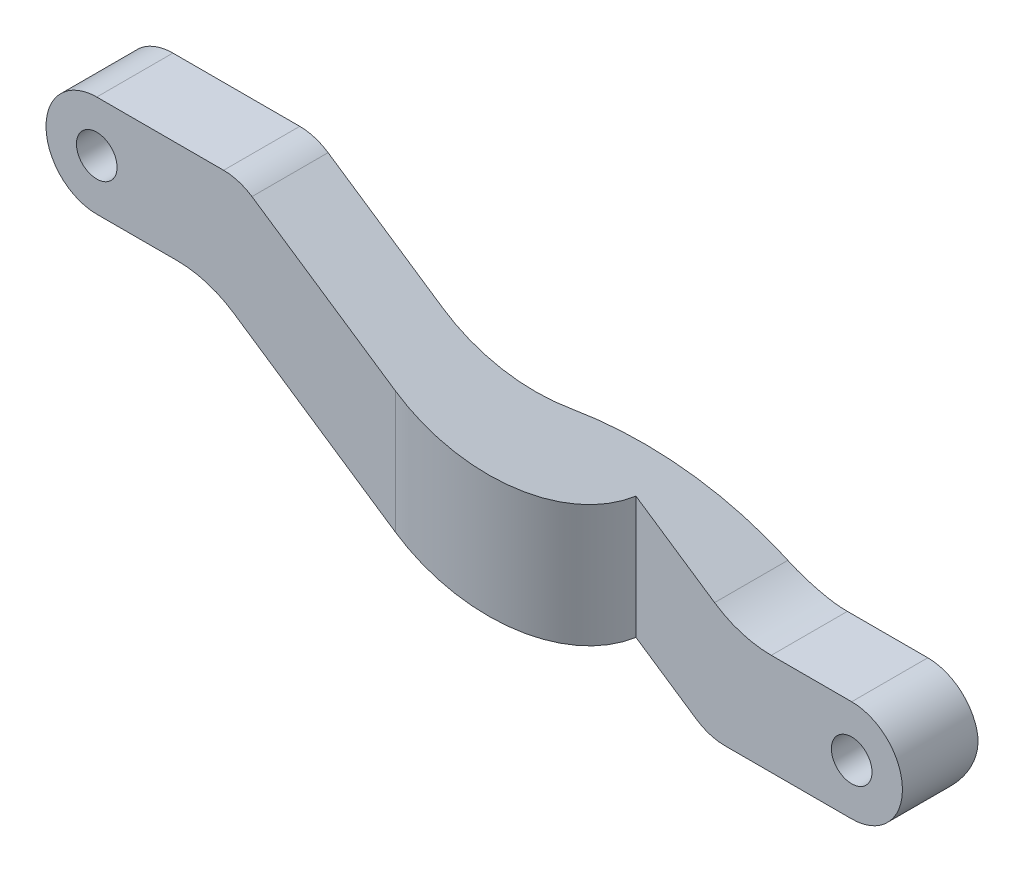
ISO-10303-21;
HEADER;
FILE_DESCRIPTION(('STEP AP214'),'2;1');
FILE_NAME('part.step','',(''),(''),'','','');
FILE_SCHEMA(('AUTOMOTIVE_DESIGN { 1 0 10303 214 1 1 1 1 }'));
ENDSEC;
DATA;
#1=APPLICATION_CONTEXT('core data for automotive mechanical design processes');
#2=APPLICATION_PROTOCOL_DEFINITION('international standard','automotive_design',2000,#1);
#3=PRODUCT_CONTEXT('',#1,'mechanical');
#4=PRODUCT('Part','Part','',(#3));
#5=PRODUCT_RELATED_PRODUCT_CATEGORY('part','',(#4));
#6=PRODUCT_DEFINITION_FORMATION('','',#4);
#7=PRODUCT_DEFINITION_CONTEXT('part definition',#1,'design');
#8=PRODUCT_DEFINITION('design','',#6,#7);
#9=PRODUCT_DEFINITION_SHAPE('','',#8);
#10=(LENGTH_UNIT() NAMED_UNIT(*) SI_UNIT(.MILLI.,.METRE.));
#11=(NAMED_UNIT(*) PLANE_ANGLE_UNIT() SI_UNIT($,.RADIAN.));
#12=(NAMED_UNIT(*) SI_UNIT($,.STERADIAN.) SOLID_ANGLE_UNIT());
#13=UNCERTAINTY_MEASURE_WITH_UNIT(LENGTH_MEASURE(1.E-05),#10,'distance_accuracy_value','');
#14=(GEOMETRIC_REPRESENTATION_CONTEXT(3) GLOBAL_UNCERTAINTY_ASSIGNED_CONTEXT((#13)) GLOBAL_UNIT_ASSIGNED_CONTEXT((#10,
#11,#12)) REPRESENTATION_CONTEXT('',''));
#15=CARTESIAN_POINT('',(0.,0.,0.));
#16=DIRECTION('',(0.,0.,1.));
#17=DIRECTION('',(1.,0.,0.));
#18=AXIS2_PLACEMENT_3D('',#15,#16,#17);
#19=CARTESIAN_POINT('',(0.,-5.5,-4.5));
#20=DIRECTION('',(0.,0.,-1.));
#21=DIRECTION('',(-1.,0.,0.));
#22=AXIS2_PLACEMENT_3D('',#19,#20,#21);
#23=CYLINDRICAL_SURFACE('',#22,0.799999999999998);
#24=CARTESIAN_POINT('',(0.,-5.5,-9.));
#25=DIRECTION('',(0.,0.,1.));
#26=DIRECTION('',(1.,0.,0.));
#27=AXIS2_PLACEMENT_3D('',#24,#25,#26);
#28=CIRCLE('',#27,0.799999999999998);
#29=CARTESIAN_POINT('',(0.799999999999998,-5.5,-9.));
#30=VERTEX_POINT('',#29);
#31=EDGE_CURVE('E434',#30,#30,#28,.T.);
#32=ORIENTED_EDGE('',*,*,#31,.T.);
#33=EDGE_LOOP('',(#32));
#34=FACE_BOUND('',#33,.T.);
#35=CARTESIAN_POINT('',(0.,-5.5,-10.5));
#36=DIRECTION('',(0.,0.,-1.));
#37=DIRECTION('',(-1.,0.,0.));
#38=AXIS2_PLACEMENT_3D('',#35,#36,#37);
#39=CIRCLE('',#38,0.799999999999998);
#40=CARTESIAN_POINT('',(-0.799999999999997,-5.5,-10.5));
#41=VERTEX_POINT('',#40);
#42=EDGE_CURVE('E47',#41,#41,#39,.T.);
#43=ORIENTED_EDGE('',*,*,#42,.T.);
#44=EDGE_LOOP('',(#43));
#45=FACE_BOUND('',#44,.T.);
#46=ADVANCED_FACE('F43',(#34,#45),#23,.F.);
#47=CARTESIAN_POINT('',(-5.22291133313636,-7.76072430045907,-4.5));
#48=DIRECTION('',(-0.558328318996176,-0.829620086670341,0.));
#49=DIRECTION('',(0.829620086670341,-0.558328318996176,0.));
#50=AXIS2_PLACEMENT_3D('',#47,#48,#49);
#51=PLANE('',#50);
#52=CARTESIAN_POINT('',(-3.89835345575501,-8.65214217349972,-2.));
#53=DIRECTION('',(-0.558328318996176,-0.829620086670341,0.));
#54=DIRECTION('',(0.829620086670341,-0.558328318996176,0.));
#55=AXIS2_PLACEMENT_3D('',#52,#53,#54);
#56=ELLIPSE('',#55,12.0537100784707,10.);
#57=CARTESIAN_POINT('',(-11.0397818842979,-3.84601248377317,-9.));
#58=VERTEX_POINT('',#57);
#59=CARTESIAN_POINT('',(-6.75535476145084,-6.72940095494858,-11.5831906763485));
#60=VERTEX_POINT('',#59);
#61=EDGE_CURVE('E461',#58,#60,#56,.T.);
#62=ORIENTED_EDGE('',*,*,#61,.T.);
#63=CARTESIAN_POINT('',(-7.44776461675071,-6.26341412943989,-11.7943579510743));
#64=CARTESIAN_POINT('',(-7.39082496292304,-6.30173410471108,-11.7808860215062));
#65=CARTESIAN_POINT('',(-7.33400862964027,-6.33997108614744,-11.7666329862026));
#66=CARTESIAN_POINT('',(-7.22067273472351,-6.41624532384669,-11.736400693206));
#67=CARTESIAN_POINT('',(-7.16415328375281,-6.45428250563398,-11.7204208339319));
#68=CARTESIAN_POINT('',(-7.05135145071648,-6.53019732354978,-11.6865350971831));
#69=CARTESIAN_POINT('',(-6.99507009825785,-6.56807426676023,-11.6686242126672));
#70=CARTESIAN_POINT('',(-6.88300399879011,-6.64349394130475,-11.6307014867902));
#71=CARTESIAN_POINT('',(-6.82721917633171,-6.68103672341567,-11.6106899707501));
#72=CARTESIAN_POINT('',(-6.71540744172286,-6.75628521224958,-11.5679643601963));
#73=CARTESIAN_POINT('',(-6.65939023573404,-6.793984386796,-11.545213104872));
#74=CARTESIAN_POINT('',(-6.54825145805766,-6.8687799804808,-11.4969172994951));
#75=CARTESIAN_POINT('',(-6.49312902529173,-6.90587697911869,-11.4713756434074));
#76=CARTESIAN_POINT('',(-6.38347733178552,-6.9796717759107,-11.4167197123286));
#77=CARTESIAN_POINT('',(-6.32895890664111,-7.01636228178716,-11.3875733803327));
#78=CARTESIAN_POINT('',(-6.24835741066871,-7.07060650571314,-11.3407692581652));
#79=CARTESIAN_POINT('',(-6.22166317898296,-7.0885715306004,-11.3246381424522));
#80=CARTESIAN_POINT('',(-6.16876633712455,-7.12417072265172,-11.2912235391192));
#81=CARTESIAN_POINT('',(-6.14256387976717,-7.14180478697221,-11.2739397006547));
#82=CARTESIAN_POINT('',(-6.11665663799235,-7.15924017334047,-11.2560194935183));
#83=B_SPLINE_CURVE_WITH_KNOTS('',3,(#63,#64,#65,#66,#67,#68,#69,#70,#71,#72,#73,#74,#75,#76,#77,
#78,#79,#80,#81,#82),.UNSPECIFIED.,.F.,.F.,(4,2,2,2,2,2,2,2,2,4),(0.,0.209831551112915,
0.419736439270804,0.630199320987733,0.840629656668131,1.05432960988827,1.26780999882545,
1.48334768269615,1.59130768329374,1.69930069404956),.UNSPECIFIED.);
#84=CARTESIAN_POINT('',(-6.11665663799226,-7.15924017334044,-11.2560194935185));
#85=VERTEX_POINT('',#84);
#86=EDGE_CURVE('E65',#60,#85,#83,.T.);
#87=ORIENTED_EDGE('',*,*,#86,.T.);
#88=DIRECTION('',(0.,0.,-1.));
#89=VECTOR('',#88,1.);
#90=CARTESIAN_POINT('',(-6.11665663799226,-7.15924017334053,-4.5));
#91=LINE('',#90,#89);
#92=CARTESIAN_POINT('',(-6.11665663799226,-7.15924017334053,-9.));
#93=VERTEX_POINT('',#92);
#94=EDGE_CURVE('E301',#93,#85,#91,.T.);
#95=ORIENTED_EDGE('',*,*,#94,.F.);
#96=DIRECTION('',(-0.829620086670341,0.558328318996176,0.));
#97=VECTOR('',#96,1.);
#98=CARTESIAN_POINT('',(-5.22291133313636,-7.76072430045907,-9.));
#99=LINE('',#98,#97);
#100=CARTESIAN_POINT('',(-8.5,-5.55526732567099,-9.));
#101=VERTEX_POINT('',#100);
#102=EDGE_CURVE('E440',#93,#101,#99,.T.);
#103=ORIENTED_EDGE('',*,*,#102,.T.);
#104=CARTESIAN_POINT('',(-13.4749371855331,-2.20717057567752,-9.5));
#105=DIRECTION('',(-0.558328318996176,-0.829620086670341,0.));
#106=DIRECTION('',(0.829620086670341,-0.558328318996176,0.));
#107=AXIS2_PLACEMENT_3D('',#104,#105,#106);
#108=ELLIPSE('',#107,6.02685503923534,5.);
#109=CARTESIAN_POINT('',(-13.4749371855331,-2.20717057567752,-4.5));
#110=VERTEX_POINT('',#109);
#111=EDGE_CURVE('E391',#101,#110,#108,.T.);
#112=ORIENTED_EDGE('',*,*,#111,.T.);
#113=DIRECTION('',(-0.829620086670341,0.558328318996176,0.));
#114=VECTOR('',#113,1.);
#115=CARTESIAN_POINT('',(-5.22291133313636,-7.76072430045907,-4.5));
#116=LINE('',#115,#114);
#117=CARTESIAN_POINT('',(-19.8476514900797,2.08162006749579,-4.5));
#118=VERTEX_POINT('',#117);
#119=EDGE_CURVE('E388',#110,#118,#116,.T.);
#120=ORIENTED_EDGE('',*,*,#119,.T.);
#121=DIRECTION('',(0.,0.,-1.));
#122=VECTOR('',#121,1.);
#123=CARTESIAN_POINT('',(-19.8476514900797,2.08162006749579,-12.));
#124=LINE('',#123,#122);
#125=CARTESIAN_POINT('',(-19.8476514900797,2.08162006749579,-7.5));
#126=VERTEX_POINT('',#125);
#127=EDGE_CURVE('E340',#118,#126,#124,.T.);
#128=ORIENTED_EDGE('',*,*,#127,.T.);
#129=DIRECTION('',(0.829620086670341,-0.558328318996176,0.));
#130=VECTOR('',#129,1.);
#131=CARTESIAN_POINT('',(-5.22291133313636,-7.76072430045907,-7.5));
#132=LINE('',#131,#130);
#133=CARTESIAN_POINT('',(-14.6104960985693,-1.4429476389099,-7.5));
#134=VERTEX_POINT('',#133);
#135=EDGE_CURVE('E385',#126,#134,#132,.T.);
#136=ORIENTED_EDGE('',*,*,#135,.T.);
#137=CARTESIAN_POINT('',(-14.6104960985693,-1.4429476389099,-12.5));
#138=DIRECTION('',(-0.558328318996176,-0.829620086670341,0.));
#139=DIRECTION('',(0.829620086670341,-0.558328318996176,0.));
#140=AXIS2_PLACEMENT_3D('',#137,#138,#139);
#141=ELLIPSE('',#140,6.02685503923534,5.);
#142=EDGE_CURVE('E471',#134,#58,#141,.F.);
#143=ORIENTED_EDGE('',*,*,#142,.T.);
#144=EDGE_LOOP('',(#62,#87,#95,#103,#112,#120,#128,#136,#143));
#145=FACE_BOUND('',#144,.T.);
#146=ADVANCED_FACE('F206',(#145),#51,.T.);
#147=CARTESIAN_POINT('',(-5.,-5.5,-4.5));
#148=DIRECTION('',(0.,0.,-1.));
#149=DIRECTION('',(-1.,0.,0.));
#150=AXIS2_PLACEMENT_3D('',#147,#148,#149);
#151=CYLINDRICAL_SURFACE('',#150,1.99999999999982);
#152=CARTESIAN_POINT('',(-6.11665663799226,-7.15924017334044,-11.2560194935185));
#153=CARTESIAN_POINT('',(-6.01070827811085,-7.23050023380487,-11.1827244448648));
#154=CARTESIAN_POINT('',(-5.8995708494193,-7.29060982241429,-11.1066673038132));
#155=CARTESIAN_POINT('',(-5.66252875240181,-7.39176975725393,-10.9455439157998));
#156=CARTESIAN_POINT('',(-5.5361336285723,-7.43126431759017,-10.8602158791605));
#157=CARTESIAN_POINT('',(-5.27563910793045,-7.48549941127549,-10.6849100836675));
#158=CARTESIAN_POINT('',(-5.14142257519711,-7.49948810941587,-10.5948692521531));
#159=CARTESIAN_POINT('',(-5.00495179452469,-7.49999541093032,-10.5033217646004));
#160=CARTESIAN_POINT('',(-5.00247585205687,-7.50000000859125,-10.5016608518913));
#161=CARTESIAN_POINT('',(-5.,-7.49999999999991,-10.5));
#162=B_SPLINE_CURVE_WITH_KNOTS('',3,(#152,#153,#154,#155,#156,#157,#158,#159,#160,#161),
.UNSPECIFIED.,.F.,.F.,(4,2,2,2,4),(0.,0.440710293324501,0.91109410684645,1.39513215593204,
1.40407643847738),.UNSPECIFIED.);
#163=CARTESIAN_POINT('',(-4.99999999999998,-7.5,-10.5));
#164=VERTEX_POINT('',#163);
#165=EDGE_CURVE('E186',#164,#85,#162,.F.);
#166=ORIENTED_EDGE('',*,*,#165,.F.);
#167=DIRECTION('',(0.,0.,-1.));
#168=VECTOR('',#167,1.);
#169=CARTESIAN_POINT('',(-4.99999999999998,-7.49999999999982,-4.5));
#170=LINE('',#169,#168);
#171=CARTESIAN_POINT('',(-4.99999999999998,-7.5,-9.));
#172=VERTEX_POINT('',#171);
#173=EDGE_CURVE('E299',#172,#164,#170,.T.);
#174=ORIENTED_EDGE('',*,*,#173,.F.);
#175=CARTESIAN_POINT('',(-5.,-5.5,-9.));
#176=DIRECTION('',(0.,0.,1.));
#177=DIRECTION('',(1.,0.,0.));
#178=AXIS2_PLACEMENT_3D('',#175,#176,#177);
#179=CIRCLE('',#178,1.99999999999982);
#180=EDGE_CURVE('E438',#93,#172,#179,.T.);
#181=ORIENTED_EDGE('',*,*,#180,.F.);
#182=ORIENTED_EDGE('',*,*,#94,.T.);
#183=EDGE_LOOP('',(#166,#174,#181,#182));
#184=FACE_BOUND('',#183,.T.);
#185=ADVANCED_FACE('F281',(#184),#151,.T.);
#186=CARTESIAN_POINT('',(-2.6411164921747E-13,-7.5,-4.5));
#187=DIRECTION('',(0.,-1.,0.));
#188=DIRECTION('',(1.,0.,0.));
#189=AXIS2_PLACEMENT_3D('',#186,#187,#188);
#190=PLANE('',#189);
#191=ORIENTED_EDGE('',*,*,#173,.T.);
#192=DIRECTION('',(1.,0.,0.));
#193=VECTOR('',#192,1.);
#194=CARTESIAN_POINT('',(-27.25,-7.5,-10.5));
#195=LINE('',#194,#193);
#196=CARTESIAN_POINT('',(0.,-7.5,-10.5));
#197=VERTEX_POINT('',#196);
#198=EDGE_CURVE('E188',#164,#197,#195,.T.);
#199=ORIENTED_EDGE('',*,*,#198,.T.);
#200=DIRECTION('',(0.,0.,-1.));
#201=VECTOR('',#200,1.);
#202=CARTESIAN_POINT('',(0.,-7.5,-4.5));
#203=LINE('',#202,#201);
#204=CARTESIAN_POINT('',(0.,-7.5,-9.));
#205=VERTEX_POINT('',#204);
#206=EDGE_CURVE('E306',#205,#197,#203,.T.);
#207=ORIENTED_EDGE('',*,*,#206,.F.);
#208=DIRECTION('',(1.,0.,0.));
#209=VECTOR('',#208,1.);
#210=CARTESIAN_POINT('',(-8.5,-7.5,-9.));
#211=LINE('',#210,#209);
#212=EDGE_CURVE('E305',#172,#205,#211,.T.);
#213=ORIENTED_EDGE('',*,*,#212,.F.);
#214=EDGE_LOOP('',(#191,#199,#207,#213));
#215=FACE_BOUND('',#214,.T.);
#216=ADVANCED_FACE('F244',(#215),#190,.T.);
#217=CARTESIAN_POINT('',(0.,-5.5,-4.5));
#218=DIRECTION('',(0.,0.,-1.));
#219=DIRECTION('',(-1.,0.,0.));
#220=AXIS2_PLACEMENT_3D('',#217,#218,#219);
#221=CYLINDRICAL_SURFACE('',#220,2.);
#222=CARTESIAN_POINT('',(1.9364916731037,-5.,-12.));
#223=CARTESIAN_POINT('',(1.94923392572045,-5.04932114358372,-12.0000051867644));
#224=CARTESIAN_POINT('',(1.96007760968778,-5.09913225941096,-11.9991243200771));
#225=CARTESIAN_POINT('',(1.97792914676068,-5.19936735755571,-11.9955247867632));
#226=CARTESIAN_POINT('',(1.98493730657872,-5.24979129053882,-11.9928062671257));
#227=CARTESIAN_POINT('',(1.99506727771935,-5.35075466707215,-11.9854757968448));
#228=CARTESIAN_POINT('',(1.99819966781951,-5.40129341731143,-11.9808690460807));
#229=CARTESIAN_POINT('',(2.00063688520671,-5.50223782087149,-11.9697422920158));
#230=CARTESIAN_POINT('',(1.99994180028854,-5.55264347721865,-11.9632223326037));
#231=CARTESIAN_POINT('',(1.99217992905659,-5.70321693633348,-11.9407687393341));
#232=CARTESIAN_POINT('',(1.97943572214433,-5.80273298729622,-11.9219419759768));
#233=CARTESIAN_POINT('',(1.93978151030911,-5.99710218667242,-11.8769530945645));
#234=CARTESIAN_POINT('',(1.91286860891535,-6.09195437732795,-11.850789477166));
#235=CARTESIAN_POINT('',(1.84518258819586,-6.27810497671866,-11.7907667679181));
#236=CARTESIAN_POINT('',(1.80395413835133,-6.36916008465087,-11.7566688232968));
#237=CARTESIAN_POINT('',(1.70979795459834,-6.54226510376168,-11.6822853018577));
#238=CARTESIAN_POINT('',(1.65686153587891,-6.62430826202862,-11.6419951385416));
#239=CARTESIAN_POINT('',(1.53510240830725,-6.78639115870666,-11.5516802716319));
#240=CARTESIAN_POINT('',(1.4651873724096,-6.86528335533427,-11.5010756077231));
#241=CARTESIAN_POINT('',(1.31602755206121,-7.00958073663753,-11.3949080896696));
#242=CARTESIAN_POINT('',(1.23678935290203,-7.07499535223775,-11.3393487418346));
#243=CARTESIAN_POINT('',(1.10724930204743,-7.16651894037302,-11.2494533692392));
#244=CARTESIAN_POINT('',(1.05933263150913,-7.19735717739104,-11.2163839416346));
#245=CARTESIAN_POINT('',(0.961590718329308,-7.25457978817494,-11.1492267688548));
#246=CARTESIAN_POINT('',(0.911765388196588,-7.28096395747003,-11.1151389770144));
#247=CARTESIAN_POINT('',(0.758957395729926,-7.35385972531109,-11.0109508294172));
#248=CARTESIAN_POINT('',(0.653519174774761,-7.39350220876982,-10.9395318751726));
#249=CARTESIAN_POINT('',(0.438862700059606,-7.45444553533482,-10.7946785608128));
#250=CARTESIAN_POINT('',(0.329644176636772,-7.47574506715459,-10.7212440569987));
#251=CARTESIAN_POINT('',(0.149143166037845,-7.49569445807546,-10.600049813911));
#252=CARTESIAN_POINT('',(0.0782774000548524,-7.49972305566518,-10.5525101281418));
#253=CARTESIAN_POINT('',(0.00495185100895912,-7.49999540312661,-10.5033218026081));
#254=CARTESIAN_POINT('',(0.00247590904470673,-7.50000000075853,-10.501660890246));
#255=CARTESIAN_POINT('',(0.,-7.5,-10.5));
#256=B_SPLINE_CURVE_WITH_KNOTS('',3,(#222,#223,#224,#225,#226,#227,#228,#229,#230,#231,#232,
#233,#234,#235,#236,#237,#238,#239,#240,#241,#242,#243,#244,#245,#246,#247,#248,#249,#250,#251,
#252,#253,#254,#255),.UNSPECIFIED.,.F.,.F.,(4,2,2,2,2,2,2,2,2,2,2,2,2,2,2,2,4),(0.,
0.152775312722179,0.305538406790276,0.457883612927219,0.610225324577635,0.914933339499428,
1.21970366932024,1.53522221812839,1.85097560396788,2.20041541825002,2.54960987560957,
2.7470913717999,2.94458193121657,3.34321361891619,3.74187380131958,3.99781423908749,
4.00675852163284),.UNSPECIFIED.);
#257=CARTESIAN_POINT('',(1.9364916731037,-5.,-12.));
#258=VERTEX_POINT('',#257);
#259=EDGE_CURVE('E229',#258,#197,#256,.T.);
#260=ORIENTED_EDGE('',*,*,#259,.F.);
#261=CARTESIAN_POINT('',(0.,-5.5,-12.));
#262=DIRECTION('',(0.,0.,1.));
#263=DIRECTION('',(1.,0.,0.));
#264=AXIS2_PLACEMENT_3D('',#261,#262,#263);
#265=CIRCLE('',#264,2.);
#266=CARTESIAN_POINT('',(0.,-3.5,-12.));
#267=VERTEX_POINT('',#266);
#268=EDGE_CURVE('E316',#258,#267,#265,.T.);
#269=ORIENTED_EDGE('',*,*,#268,.T.);
#270=DIRECTION('',(0.,0.,-1.));
#271=VECTOR('',#270,1.);
#272=CARTESIAN_POINT('',(0.,-3.5,-4.5));
#273=LINE('',#272,#271);
#274=CARTESIAN_POINT('',(0.,-3.5,-9.));
#275=VERTEX_POINT('',#274);
#276=EDGE_CURVE('E310',#275,#267,#273,.T.);
#277=ORIENTED_EDGE('',*,*,#276,.F.);
#278=CARTESIAN_POINT('',(0.,-5.5,-9.));
#279=DIRECTION('',(0.,0.,1.));
#280=DIRECTION('',(1.,0.,0.));
#281=AXIS2_PLACEMENT_3D('',#278,#279,#280);
#282=CIRCLE('',#281,2.);
#283=EDGE_CURVE('E432',#205,#275,#282,.T.);
#284=ORIENTED_EDGE('',*,*,#283,.F.);
#285=ORIENTED_EDGE('',*,*,#206,.T.);
#286=EDGE_LOOP('',(#260,#269,#277,#284,#285));
#287=FACE_BOUND('',#286,.T.);
#288=ADVANCED_FACE('F238',(#287),#221,.T.);
#289=CARTESIAN_POINT('',(-3.89835345575501,-7.5,-2.));
#290=DIRECTION('',(0.,-1.,0.));
#291=DIRECTION('',(0.,0.,-1.));
#292=AXIS2_PLACEMENT_3D('',#289,#290,#291);
#293=CYLINDRICAL_SURFACE('',#292,10.);
#294=DIRECTION('',(0.,1.,0.));
#295=VECTOR('',#294,1.);
#296=CARTESIAN_POINT('',(-3.89835345575501,1.78993958788463,-12.));
#297=LINE('',#296,#295);
#298=CARTESIAN_POINT('',(-3.89835345575501,-5.,-12.));
#299=VERTEX_POINT('',#298);
#300=CARTESIAN_POINT('',(-3.89835345575501,-3.43294990195937,-12.));
#301=VERTEX_POINT('',#300);
#302=EDGE_CURVE('E352',#299,#301,#297,.T.);
#303=ORIENTED_EDGE('',*,*,#302,.F.);
#304=CARTESIAN_POINT('',(-9.16618033218138,-7.5,-10.5));
#305=CARTESIAN_POINT('',(-9.07756409111643,-7.49997410544574,-10.5549334004123));
#306=CARTESIAN_POINT('',(-8.9881861652615,-7.49497443105366,-10.6083932504337));
#307=CARTESIAN_POINT('',(-8.80865738288342,-7.47642295219843,-10.7120359467655));
#308=CARTESIAN_POINT('',(-8.71850857232119,-7.46288934274092,-10.7622255150026));
#309=CARTESIAN_POINT('',(-8.53794138668141,-7.42867904124938,-10.8591609635262));
#310=CARTESIAN_POINT('',(-8.44752361136092,-7.40801299529733,-10.9059118510276));
#311=CARTESIAN_POINT('',(-8.26655128903526,-7.36064894058404,-10.9960586592919));
#312=CARTESIAN_POINT('',(-8.17599669264426,-7.33394734665204,-11.0394525653291));
#313=CARTESIAN_POINT('',(-7.90479839716351,-7.24637246236207,-11.164495978491));
#314=CARTESIAN_POINT('',(-7.72428639768302,-7.17795864522028,-11.2411852270175));
#315=CARTESIAN_POINT('',(-7.36465228658494,-7.02694628122832,-11.3820087991363));
#316=CARTESIAN_POINT('',(-7.18552948999485,-6.94435526005757,-11.4461497452836));
#317=CARTESIAN_POINT('',(-6.87128913527116,-6.78987712960858,-11.5489292372363));
#318=CARTESIAN_POINT('',(-6.7358867166259,-6.72014996369898,-11.589998972725));
#319=CARTESIAN_POINT('',(-6.46579316225558,-6.57602440374742,-11.6658122857316));
#320=CARTESIAN_POINT('',(-6.33110213729533,-6.50162530424743,-11.7005549047563));
#321=CARTESIAN_POINT('',(-5.94583955306281,-6.28315088159365,-11.791543096305));
#322=CARTESIAN_POINT('',(-5.69602362758934,-6.13458031375426,-11.8403232309853));
#323=CARTESIAN_POINT('',(-5.2468682373556,-5.85993180728521,-11.9107270250432));
#324=CARTESIAN_POINT('',(-5.04723504041764,-5.73515485338453,-11.9357998771237));
#325=CARTESIAN_POINT('',(-4.53647388952695,-5.41186585329517,-11.9845253321843));
#326=CARTESIAN_POINT('',(-4.22572242231347,-5.21131507079299,-11.9994649480732));
#327=CARTESIAN_POINT('',(-3.90955564344135,-5.00723097139082,-11.9999952775982));
#328=CARTESIAN_POINT('',(-3.90395452069468,-5.00361546194748,-11.9999999828098));
#329=CARTESIAN_POINT('',(-3.89835345575501,-5.,-12.));
#330=B_SPLINE_CURVE_WITH_KNOTS('',3,(#304,#305,#306,#307,#308,#309,#310,#311,#312,#313,#314,
#315,#316,#317,#318,#319,#320,#321,#322,#323,#324,#325,#326,#327,#328,#329),.UNSPECIFIED.,.F.,
.F.,(4,2,2,2,2,2,2,2,2,2,2,2,4),(0.,0.312469154378763,0.624274342689414,0.935616120062713,
1.24714332559065,1.8690510873226,2.490629737169,2.96364036305792,3.43672258570548,
4.31987981734611,5.02988751982109,6.13881633574588,6.1588163407286),.UNSPECIFIED.);
#331=EDGE_CURVE('E52',#299,#60,#330,.F.);
#332=ORIENTED_EDGE('',*,*,#331,.T.);
#333=ORIENTED_EDGE('',*,*,#61,.F.);
#334=DIRECTION('',(0.,-1.,0.));
#335=VECTOR('',#334,1.);
#336=CARTESIAN_POINT('',(-11.0397818842979,-7.5,-9.));
#337=LINE('',#336,#335);
#338=CARTESIAN_POINT('',(-11.0397818842979,0.975471547614982,-8.99999999999999));
#339=VERTEX_POINT('',#338);
#340=EDGE_CURVE('E463',#58,#339,#337,.F.);
#341=ORIENTED_EDGE('',*,*,#340,.T.);
#342=CARTESIAN_POINT('',(-3.89835345575501,-3.83065814211167,-2.));
#343=DIRECTION('',(-0.558328318996185,-0.829620086670335,0.));
#344=DIRECTION('',(0.829620086670335,-0.558328318996185,0.));
#345=AXIS2_PLACEMENT_3D('',#342,#343,#344);
#346=ELLIPSE('',#345,12.0537100784708,10.);
#347=CARTESIAN_POINT('',(-5.40234850992032,-2.81848034668135,-11.8862530251378));
#348=VERTEX_POINT('',#347);
#349=EDGE_CURVE('E361',#348,#339,#346,.F.);
#350=ORIENTED_EDGE('',*,*,#349,.F.);
#351=CARTESIAN_POINT('',(-3.89835345575501,-3.43294990195937,-12.));
#352=CARTESIAN_POINT('',(-4.00554713830693,-3.41308839987882,-12.0000151978007));
#353=CARTESIAN_POINT('',(-4.11191312464791,-3.38881587462305,-11.9982769840187));
#354=CARTESIAN_POINT('',(-4.32224284560452,-3.33170389748572,-11.991561901392));
#355=CARTESIAN_POINT('',(-4.42620603517285,-3.29886252222221,-11.9865843050534));
#356=CARTESIAN_POINT('',(-4.62915850962425,-3.22551891739318,-11.9737709832304));
#357=CARTESIAN_POINT('',(-4.72820279541007,-3.18515948265948,-11.9659863422502));
#358=CARTESIAN_POINT('',(-4.9225085715038,-3.09676404643313,-11.9478949341915));
#359=CARTESIAN_POINT('',(-5.01777212169358,-3.04873229881846,-11.9375895630474));
#360=CARTESIAN_POINT('',(-5.16061861175357,-2.96941482535517,-11.9201413785456));
#361=CARTESIAN_POINT('',(-5.20976217281389,-2.94073639448771,-11.9137582163371));
#362=CARTESIAN_POINT('',(-5.30695824658546,-2.88120501895662,-11.9004166736691));
#363=CARTESIAN_POINT('',(-5.35500450164558,-2.85034243351023,-11.8934557160617));
#364=CARTESIAN_POINT('',(-5.40234850992032,-2.81848034668135,-11.8862530251378));
#365=B_SPLINE_CURVE_WITH_KNOTS('',3,(#351,#352,#353,#354,#355,#356,#357,#358,#359,#360,#361,
#362,#363,#364),.UNSPECIFIED.,.F.,.F.,(4,2,2,2,2,2,4),(0.,0.326935738099752,0.653944924104012,
0.975280760215869,1.2964390476709,1.46816067089838,1.64069426241253),.UNSPECIFIED.);
#366=EDGE_CURVE('E354',#301,#348,#365,.T.);
#367=ORIENTED_EDGE('',*,*,#366,.F.);
#368=EDGE_LOOP('',(#303,#332,#333,#341,#350,#367));
#369=FACE_BOUND('',#368,.T.);
#370=ADVANCED_FACE('F243',(#369),#293,.T.);
#371=CARTESIAN_POINT('',(-2.9895980571518,-4.44224395377784,-4.5));
#372=DIRECTION('',(-0.558328318996185,-0.829620086670335,0.));
#373=DIRECTION('',(0.829620086670335,-0.558328318996185,0.));
#374=AXIS2_PLACEMENT_3D('',#371,#372,#373);
#375=PLANE('',#374);
#376=DIRECTION('',(-0.829620086670335,0.558328318996185,0.));
#377=VECTOR('',#376,1.);
#378=CARTESIAN_POINT('',(-2.9895980571518,-4.44224395377784,-4.5));
#379=LINE('',#378,#377);
#380=CARTESIAN_POINT('',(-13.4749371855331,2.61431345571067,-4.5));
#381=VERTEX_POINT('',#380);
#382=CARTESIAN_POINT('',(-19.1333433620077,6.42237989415514,-4.5));
#383=VERTEX_POINT('',#382);
#384=EDGE_CURVE('E393',#381,#383,#379,.T.);
#385=ORIENTED_EDGE('',*,*,#384,.F.);
#386=CARTESIAN_POINT('',(-13.4749371855331,2.61431345571067,-9.5));
#387=DIRECTION('',(-0.558328318996185,-0.829620086670335,0.));
#388=DIRECTION('',(0.829620086670335,-0.558328318996185,0.));
#389=AXIS2_PLACEMENT_3D('',#386,#387,#388);
#390=ELLIPSE('',#389,6.02685503923538,5.);
#391=CARTESIAN_POINT('',(-8.5,-0.733783294282867,-9.));
#392=VERTEX_POINT('',#391);
#393=EDGE_CURVE('E459',#381,#392,#390,.F.);
#394=ORIENTED_EDGE('',*,*,#393,.T.);
#395=DIRECTION('',(-0.829620086670335,0.558328318996185,0.));
#396=VECTOR('',#395,1.);
#397=CARTESIAN_POINT('',(-2.9895980571518,-4.44224395377784,-9.));
#398=LINE('',#397,#396);
#399=CARTESIAN_POINT('',(-5.40234850992032,-2.81848034668135,-9.));
#400=VERTEX_POINT('',#399);
#401=EDGE_CURVE('E431',#400,#392,#398,.T.);
#402=ORIENTED_EDGE('',*,*,#401,.F.);
#403=DIRECTION('',(0.,0.,-1.));
#404=VECTOR('',#403,1.);
#405=CARTESIAN_POINT('',(-5.40234850992032,-2.81848034668135,-12.));
#406=LINE('',#405,#404);
#407=EDGE_CURVE('E334',#400,#348,#406,.T.);
#408=ORIENTED_EDGE('',*,*,#407,.T.);
#409=ORIENTED_EDGE('',*,*,#349,.T.);
#410=CARTESIAN_POINT('',(-14.6104960985693,3.3785363924783,-12.5));
#411=DIRECTION('',(-0.558328318996185,-0.829620086670335,0.));
#412=DIRECTION('',(0.829620086670335,-0.558328318996185,0.));
#413=AXIS2_PLACEMENT_3D('',#410,#411,#412);
#414=ELLIPSE('',#413,6.02685503923538,5.);
#415=CARTESIAN_POINT('',(-14.6104960985693,3.3785363924783,-7.5));
#416=VERTEX_POINT('',#415);
#417=EDGE_CURVE('E470',#339,#416,#414,.T.);
#418=ORIENTED_EDGE('',*,*,#417,.T.);
#419=DIRECTION('',(0.829620086670335,-0.558328318996185,0.));
#420=VECTOR('',#419,1.);
#421=CARTESIAN_POINT('',(-2.9895980571518,-4.44224395377784,-7.5));
#422=LINE('',#421,#420);
#423=CARTESIAN_POINT('',(-19.1333433620077,6.42237989415514,-7.5));
#424=VERTEX_POINT('',#423);
#425=EDGE_CURVE('E422',#424,#416,#422,.T.);
#426=ORIENTED_EDGE('',*,*,#425,.F.);
#427=DIRECTION('',(0.,0.,1.));
#428=VECTOR('',#427,1.);
#429=CARTESIAN_POINT('',(-19.1333433620077,6.42237989415514,-4.5));
#430=LINE('',#429,#428);
#431=EDGE_CURVE('E321',#424,#383,#430,.T.);
#432=ORIENTED_EDGE('',*,*,#431,.T.);
#433=EDGE_LOOP('',(#385,#394,#402,#408,#409,#418,#426,#432));
#434=FACE_BOUND('',#433,.T.);
#435=ADVANCED_FACE('F262',(#434),#375,.F.);
#436=CARTESIAN_POINT('',(0.,6.76313972081444,-4.5));
#437=DIRECTION('',(0.,-1.,0.));
#438=DIRECTION('',(0.,0.,-1.));
#439=AXIS2_PLACEMENT_3D('',#436,#437,#438);
#440=PLANE('',#439);
#441=DIRECTION('',(-1.,0.,0.));
#442=VECTOR('',#441,1.);
#443=CARTESIAN_POINT('',(2.,6.76313972081444,-4.5));
#444=LINE('',#443,#442);
#445=CARTESIAN_POINT('',(-20.25,6.76313972081444,-4.5));
#446=VERTEX_POINT('',#445);
#447=CARTESIAN_POINT('',(-25.25,6.76313972081444,-4.5));
#448=VERTEX_POINT('',#447);
#449=EDGE_CURVE('E236',#446,#448,#444,.T.);
#450=ORIENTED_EDGE('',*,*,#449,.F.);
#451=DIRECTION('',(0.,0.,1.));
#452=VECTOR('',#451,1.);
#453=CARTESIAN_POINT('',(-20.25,6.76313972081444,-4.5));
#454=LINE('',#453,#452);
#455=CARTESIAN_POINT('',(-20.25,6.76313972081444,-7.5));
#456=VERTEX_POINT('',#455);
#457=EDGE_CURVE('E317',#456,#446,#454,.T.);
#458=ORIENTED_EDGE('',*,*,#457,.F.);
#459=DIRECTION('',(-1.,0.,0.));
#460=VECTOR('',#459,1.);
#461=CARTESIAN_POINT('',(-27.25,6.76313972081444,-7.5));
#462=LINE('',#461,#460);
#463=CARTESIAN_POINT('',(-25.25,6.76313972081444,-7.5));
#464=VERTEX_POINT('',#463);
#465=EDGE_CURVE('E408',#456,#464,#462,.T.);
#466=ORIENTED_EDGE('',*,*,#465,.T.);
#467=DIRECTION('',(0.,0.,1.));
#468=VECTOR('',#467,1.);
#469=CARTESIAN_POINT('',(-25.25,6.76313972081444,-4.5));
#470=LINE('',#469,#468);
#471=EDGE_CURVE('E308',#464,#448,#470,.T.);
#472=ORIENTED_EDGE('',*,*,#471,.T.);
#473=EDGE_LOOP('',(#450,#458,#466,#472));
#474=FACE_BOUND('',#473,.T.);
#475=ADVANCED_FACE('F260',(#474),#440,.F.);
#476=CARTESIAN_POINT('',(-20.25,4.76313972081443,-4.5));
#477=DIRECTION('',(0.,0.,1.));
#478=DIRECTION('',(1.,0.,0.));
#479=AXIS2_PLACEMENT_3D('',#476,#477,#478);
#480=CYLINDRICAL_SURFACE('',#479,2.);
#481=ORIENTED_EDGE('',*,*,#457,.T.);
#482=CARTESIAN_POINT('',(-20.25,4.76313972081443,-4.5));
#483=DIRECTION('',(0.,0.,1.));
#484=DIRECTION('',(1.,0.,0.));
#485=AXIS2_PLACEMENT_3D('',#482,#483,#484);
#486=CIRCLE('',#485,2.);
#487=EDGE_CURVE('E394',#446,#383,#486,.F.);
#488=ORIENTED_EDGE('',*,*,#487,.T.);
#489=ORIENTED_EDGE('',*,*,#431,.F.);
#490=CARTESIAN_POINT('',(-20.25,4.76313972081443,-7.5));
#491=DIRECTION('',(0.,0.,-1.));
#492=DIRECTION('',(-1.,0.,0.));
#493=AXIS2_PLACEMENT_3D('',#490,#491,#492);
#494=CIRCLE('',#493,2.);
#495=EDGE_CURVE('E419',#424,#456,#494,.F.);
#496=ORIENTED_EDGE('',*,*,#495,.T.);
#497=EDGE_LOOP('',(#481,#488,#489,#496));
#498=FACE_BOUND('',#497,.T.);
#499=ADVANCED_FACE('F258',(#498),#480,.T.);
#500=CARTESIAN_POINT('',(0.,2.76313972081444,-4.5));
#501=DIRECTION('',(0.,-1.,0.));
#502=DIRECTION('',(1.,0.,0.));
#503=AXIS2_PLACEMENT_3D('',#500,#501,#502);
#504=PLANE('',#503);
#505=DIRECTION('',(0.,0.,-1.));
#506=VECTOR('',#505,1.);
#507=CARTESIAN_POINT('',(-22.0809647660644,2.76313972081443,-4.5));
#508=LINE('',#507,#506);
#509=CARTESIAN_POINT('',(-22.0809647660644,2.76313972081443,-7.5));
#510=VERTEX_POINT('',#509);
#511=CARTESIAN_POINT('',(-22.0809647660644,2.76313972081443,-4.5));
#512=VERTEX_POINT('',#511);
#513=EDGE_CURVE('E343',#510,#512,#508,.F.);
#514=ORIENTED_EDGE('',*,*,#513,.T.);
#515=DIRECTION('',(-1.,0.,0.));
#516=VECTOR('',#515,1.);
#517=CARTESIAN_POINT('',(0.,2.76313972081444,-4.5));
#518=LINE('',#517,#516);
#519=CARTESIAN_POINT('',(-25.25,2.76313972081443,-4.5));
#520=VERTEX_POINT('',#519);
#521=EDGE_CURVE('E402',#512,#520,#518,.T.);
#522=ORIENTED_EDGE('',*,*,#521,.T.);
#523=DIRECTION('',(0.,0.,1.));
#524=VECTOR('',#523,1.);
#525=CARTESIAN_POINT('',(-25.25,2.76313972081442,-4.5));
#526=LINE('',#525,#524);
#527=CARTESIAN_POINT('',(-25.25,2.76313972081442,-7.5));
#528=VERTEX_POINT('',#527);
#529=EDGE_CURVE('E324',#528,#520,#526,.T.);
#530=ORIENTED_EDGE('',*,*,#529,.F.);
#531=DIRECTION('',(1.,0.,0.));
#532=VECTOR('',#531,1.);
#533=CARTESIAN_POINT('',(0.,2.76313972081444,-7.5));
#534=LINE('',#533,#532);
#535=EDGE_CURVE('E411',#528,#510,#534,.T.);
#536=ORIENTED_EDGE('',*,*,#535,.T.);
#537=EDGE_LOOP('',(#514,#522,#530,#536));
#538=FACE_BOUND('',#537,.T.);
#539=ADVANCED_FACE('F256',(#538),#504,.T.);
#540=CARTESIAN_POINT('',(-25.25,4.76313972081443,-4.5));
#541=DIRECTION('',(0.,0.,1.));
#542=DIRECTION('',(1.,0.,0.));
#543=AXIS2_PLACEMENT_3D('',#540,#541,#542);
#544=CYLINDRICAL_SURFACE('',#543,0.800000000000001);
#545=CARTESIAN_POINT('',(-25.25,4.76313972081443,-7.5));
#546=DIRECTION('',(0.,0.,-1.));
#547=DIRECTION('',(-1.,0.,0.));
#548=AXIS2_PLACEMENT_3D('',#545,#546,#547);
#549=CIRCLE('',#548,0.800000000000001);
#550=CARTESIAN_POINT('',(-26.05,4.76313972081443,-7.5));
#551=VERTEX_POINT('',#550);
#552=EDGE_CURVE('E416',#551,#551,#549,.F.);
#553=ORIENTED_EDGE('',*,*,#552,.F.);
#554=EDGE_LOOP('',(#553));
#555=FACE_BOUND('',#554,.T.);
#556=CARTESIAN_POINT('',(-25.25,4.76313972081443,-4.5));
#557=DIRECTION('',(0.,0.,1.));
#558=DIRECTION('',(1.,0.,0.));
#559=AXIS2_PLACEMENT_3D('',#556,#557,#558);
#560=CIRCLE('',#559,0.800000000000001);
#561=CARTESIAN_POINT('',(-24.45,4.76313972081443,-4.5));
#562=VERTEX_POINT('',#561);
#563=EDGE_CURVE('E405',#562,#562,#560,.F.);
#564=ORIENTED_EDGE('',*,*,#563,.F.);
#565=EDGE_LOOP('',(#564));
#566=FACE_BOUND('',#565,.T.);
#567=ADVANCED_FACE('F252',(#555,#566),#544,.F.);
#568=CARTESIAN_POINT('',(-25.25,4.76313972081443,-4.5));
#569=DIRECTION('',(0.,0.,1.));
#570=DIRECTION('',(1.,0.,0.));
#571=AXIS2_PLACEMENT_3D('',#568,#569,#570);
#572=CYLINDRICAL_SURFACE('',#571,2.);
#573=CARTESIAN_POINT('',(-25.25,4.76313972081443,-4.5));
#574=DIRECTION('',(0.,0.,1.));
#575=DIRECTION('',(1.,0.,0.));
#576=AXIS2_PLACEMENT_3D('',#573,#574,#575);
#577=CIRCLE('',#576,2.);
#578=EDGE_CURVE('E400',#520,#448,#577,.F.);
#579=ORIENTED_EDGE('',*,*,#578,.T.);
#580=ORIENTED_EDGE('',*,*,#471,.F.);
#581=CARTESIAN_POINT('',(-25.25,4.76313972081443,-7.5));
#582=DIRECTION('',(0.,0.,-1.));
#583=DIRECTION('',(-1.,0.,0.));
#584=AXIS2_PLACEMENT_3D('',#581,#582,#583);
#585=CIRCLE('',#584,2.);
#586=EDGE_CURVE('E414',#464,#528,#585,.F.);
#587=ORIENTED_EDGE('',*,*,#586,.T.);
#588=ORIENTED_EDGE('',*,*,#529,.T.);
#589=EDGE_LOOP('',(#579,#580,#587,#588));
#590=FACE_BOUND('',#589,.T.);
#591=ADVANCED_FACE('F255',(#590),#572,.T.);
#592=CARTESIAN_POINT('',(0.,0.,-12.));
#593=DIRECTION('',(0.,0.,-1.));
#594=DIRECTION('',(1.,0.,0.));
#595=AXIS2_PLACEMENT_3D('',#592,#593,#594);
#596=PLANE('',#595);
#597=CARTESIAN_POINT('',(0.,-5.5,-12.));
#598=DIRECTION('',(0.,0.,-1.));
#599=DIRECTION('',(-1.,0.,0.));
#600=AXIS2_PLACEMENT_3D('',#597,#598,#599);
#601=CIRCLE('',#600,1.51);
#602=CARTESIAN_POINT('',(-1.42481577756565,-5.,-12.));
#603=VERTEX_POINT('',#602);
#604=CARTESIAN_POINT('',(1.42481577756565,-5.,-12.));
#605=VERTEX_POINT('',#604);
#606=EDGE_CURVE('E57',#603,#605,#601,.T.);
#607=ORIENTED_EDGE('',*,*,#606,.F.);
#608=DIRECTION('',(1.,0.,0.));
#609=VECTOR('',#608,1.);
#610=CARTESIAN_POINT('',(-27.25,-5.,-12.));
#611=LINE('',#610,#609);
#612=EDGE_CURVE('E178',#299,#603,#611,.T.);
#613=ORIENTED_EDGE('',*,*,#612,.F.);
#614=ORIENTED_EDGE('',*,*,#302,.T.);
#615=CARTESIAN_POINT('',(-3.16903523393558,0.499999999999995,-12.));
#616=DIRECTION('',(0.,0.,-1.));
#617=DIRECTION('',(-1.,0.,0.));
#618=AXIS2_PLACEMENT_3D('',#615,#616,#617);
#619=CIRCLE('',#618,4.);
#620=CARTESIAN_POINT('',(-3.16903523393557,-3.50000000000001,-12.));
#621=VERTEX_POINT('',#620);
#622=EDGE_CURVE('E346',#301,#621,#619,.F.);
#623=ORIENTED_EDGE('',*,*,#622,.T.);
#624=DIRECTION('',(-1.,0.,0.));
#625=VECTOR('',#624,1.);
#626=CARTESIAN_POINT('',(0.,-3.5,-12.));
#627=LINE('',#626,#625);
#628=EDGE_CURVE('E442',#267,#621,#627,.T.);
#629=ORIENTED_EDGE('',*,*,#628,.F.);
#630=ORIENTED_EDGE('',*,*,#268,.F.);
#631=EDGE_CURVE('E181',#605,#258,#611,.T.);
#632=ORIENTED_EDGE('',*,*,#631,.F.);
#633=EDGE_LOOP('',(#607,#613,#614,#623,#629,#630,#632));
#634=FACE_BOUND('',#633,.T.);
#635=ADVANCED_FACE('F177',(#634),#596,.T.);
#636=CARTESIAN_POINT('',(-22.0809647660644,-1.23686027918557,-4.5));
#637=DIRECTION('',(0.,0.,1.));
#638=DIRECTION('',(1.,0.,0.));
#639=AXIS2_PLACEMENT_3D('',#636,#637,#638);
#640=CYLINDRICAL_SURFACE('',#639,4.);
#641=CARTESIAN_POINT('',(-22.0809647660644,-1.23686027918557,-7.5));
#642=DIRECTION('',(0.,0.,-1.));
#643=DIRECTION('',(-1.,0.,0.));
#644=AXIS2_PLACEMENT_3D('',#641,#642,#643);
#645=CIRCLE('',#644,4.);
#646=EDGE_CURVE('E350',#126,#510,#645,.F.);
#647=ORIENTED_EDGE('',*,*,#646,.F.);
#648=ORIENTED_EDGE('',*,*,#127,.F.);
#649=CARTESIAN_POINT('',(-22.0809647660644,-1.23686027918557,-4.5));
#650=DIRECTION('',(0.,0.,1.));
#651=DIRECTION('',(1.,0.,0.));
#652=AXIS2_PLACEMENT_3D('',#649,#650,#651);
#653=CIRCLE('',#652,4.);
#654=EDGE_CURVE('E320',#118,#512,#653,.T.);
#655=ORIENTED_EDGE('',*,*,#654,.T.);
#656=ORIENTED_EDGE('',*,*,#513,.F.);
#657=EDGE_LOOP('',(#647,#648,#655,#656));
#658=FACE_BOUND('',#657,.T.);
#659=ADVANCED_FACE('F250',(#658),#640,.F.);
#660=CARTESIAN_POINT('',(0.,-3.5,-4.5));
#661=DIRECTION('',(0.,-1.,0.));
#662=DIRECTION('',(1.,0.,0.));
#663=AXIS2_PLACEMENT_3D('',#660,#661,#662);
#664=PLANE('',#663);
#665=DIRECTION('',(-1.,0.,0.));
#666=VECTOR('',#665,1.);
#667=CARTESIAN_POINT('',(0.,-3.5,-9.));
#668=LINE('',#667,#666);
#669=CARTESIAN_POINT('',(-3.16903523393557,-3.50000000000001,-9.));
#670=VERTEX_POINT('',#669);
#671=EDGE_CURVE('E429',#275,#670,#668,.T.);
#672=ORIENTED_EDGE('',*,*,#671,.F.);
#673=ORIENTED_EDGE('',*,*,#276,.T.);
#674=ORIENTED_EDGE('',*,*,#628,.T.);
#675=DIRECTION('',(0.,0.,-1.));
#676=VECTOR('',#675,1.);
#677=CARTESIAN_POINT('',(-3.16903523393557,-3.50000000000001,-4.5));
#678=LINE('',#677,#676);
#679=EDGE_CURVE('E337',#621,#670,#678,.F.);
#680=ORIENTED_EDGE('',*,*,#679,.T.);
#681=EDGE_LOOP('',(#672,#673,#674,#680));
#682=FACE_BOUND('',#681,.T.);
#683=ADVANCED_FACE('F246',(#682),#664,.F.);
#684=CARTESIAN_POINT('',(-3.16903523393558,0.499999999999995,-4.5));
#685=DIRECTION('',(0.,0.,1.));
#686=DIRECTION('',(1.,0.,0.));
#687=AXIS2_PLACEMENT_3D('',#684,#685,#686);
#688=CYLINDRICAL_SURFACE('',#687,4.);
#689=ORIENTED_EDGE('',*,*,#622,.F.);
#690=ORIENTED_EDGE('',*,*,#366,.T.);
#691=ORIENTED_EDGE('',*,*,#407,.F.);
#692=CARTESIAN_POINT('',(-3.16903523393558,0.499999999999995,-9.));
#693=DIRECTION('',(0.,0.,1.));
#694=DIRECTION('',(1.,0.,0.));
#695=AXIS2_PLACEMENT_3D('',#692,#693,#694);
#696=CIRCLE('',#695,4.);
#697=EDGE_CURVE('E348',#670,#400,#696,.F.);
#698=ORIENTED_EDGE('',*,*,#697,.F.);
#699=ORIENTED_EDGE('',*,*,#679,.F.);
#700=EDGE_LOOP('',(#689,#690,#691,#698,#699));
#701=FACE_BOUND('',#700,.T.);
#702=ADVANCED_FACE('F249',(#701),#688,.F.);
#703=CARTESIAN_POINT('',(-8.5,-7.5,-9.));
#704=DIRECTION('',(0.,0.,1.));
#705=DIRECTION('',(1.,0.,0.));
#706=AXIS2_PLACEMENT_3D('',#703,#704,#705);
#707=PLANE('',#706);
#708=ORIENTED_EDGE('',*,*,#31,.F.);
#709=EDGE_LOOP('',(#708));
#710=FACE_BOUND('',#709,.T.);
#711=ORIENTED_EDGE('',*,*,#180,.T.);
#712=ORIENTED_EDGE('',*,*,#212,.T.);
#713=ORIENTED_EDGE('',*,*,#283,.T.);
#714=ORIENTED_EDGE('',*,*,#671,.T.);
#715=ORIENTED_EDGE('',*,*,#697,.T.);
#716=ORIENTED_EDGE('',*,*,#401,.T.);
#717=DIRECTION('',(0.,1.,0.));
#718=VECTOR('',#717,1.);
#719=CARTESIAN_POINT('',(-8.5,-7.5,-9.));
#720=LINE('',#719,#718);
#721=EDGE_CURVE('E426',#101,#392,#720,.T.);
#722=ORIENTED_EDGE('',*,*,#721,.F.);
#723=ORIENTED_EDGE('',*,*,#102,.F.);
#724=EDGE_LOOP('',(#711,#712,#713,#714,#715,#716,#722,#723));
#725=FACE_BOUND('',#724,.T.);
#726=ADVANCED_FACE('F367',(#710,#725),#707,.T.);
#727=CARTESIAN_POINT('',(-27.25,-7.5,-7.5));
#728=DIRECTION('',(0.,0.,-1.));
#729=DIRECTION('',(-1.,0.,0.));
#730=AXIS2_PLACEMENT_3D('',#727,#728,#729);
#731=PLANE('',#730);
#732=ORIENTED_EDGE('',*,*,#552,.T.);
#733=EDGE_LOOP('',(#732));
#734=FACE_BOUND('',#733,.T.);
#735=ORIENTED_EDGE('',*,*,#425,.T.);
#736=DIRECTION('',(0.,1.,0.));
#737=VECTOR('',#736,1.);
#738=CARTESIAN_POINT('',(-14.6104960985693,-3.03154444350354,-7.5));
#739=LINE('',#738,#737);
#740=EDGE_CURVE('E468',#416,#134,#739,.F.);
#741=ORIENTED_EDGE('',*,*,#740,.T.);
#742=ORIENTED_EDGE('',*,*,#135,.F.);
#743=ORIENTED_EDGE('',*,*,#646,.T.);
#744=ORIENTED_EDGE('',*,*,#535,.F.);
#745=ORIENTED_EDGE('',*,*,#586,.F.);
#746=ORIENTED_EDGE('',*,*,#465,.F.);
#747=ORIENTED_EDGE('',*,*,#495,.F.);
#748=EDGE_LOOP('',(#735,#741,#742,#743,#744,#745,#746,#747));
#749=FACE_BOUND('',#748,.T.);
#750=ADVANCED_FACE('F481',(#734,#749),#731,.T.);
#751=CARTESIAN_POINT('',(-13.4749371855331,-7.5,-9.5));
#752=DIRECTION('',(0.,-1.,0.));
#753=DIRECTION('',(0.,0.,-1.));
#754=AXIS2_PLACEMENT_3D('',#751,#752,#753);
#755=CYLINDRICAL_SURFACE('',#754,5.);
#756=ORIENTED_EDGE('',*,*,#111,.F.);
#757=ORIENTED_EDGE('',*,*,#721,.T.);
#758=ORIENTED_EDGE('',*,*,#393,.F.);
#759=DIRECTION('',(0.,1.,0.));
#760=VECTOR('',#759,1.);
#761=CARTESIAN_POINT('',(-13.4749371855331,0.,-4.5));
#762=LINE('',#761,#760);
#763=EDGE_CURVE('E331',#381,#110,#762,.F.);
#764=ORIENTED_EDGE('',*,*,#763,.T.);
#765=EDGE_LOOP('',(#756,#757,#758,#764));
#766=FACE_BOUND('',#765,.T.);
#767=ADVANCED_FACE('F474',(#766),#755,.T.);
#768=CARTESIAN_POINT('',(-14.6104960985693,-7.5,-12.5));
#769=DIRECTION('',(0.,-1.,0.));
#770=DIRECTION('',(0.,0.,-1.));
#771=AXIS2_PLACEMENT_3D('',#768,#769,#770);
#772=CYLINDRICAL_SURFACE('',#771,5.);
#773=ORIENTED_EDGE('',*,*,#142,.F.);
#774=ORIENTED_EDGE('',*,*,#740,.F.);
#775=ORIENTED_EDGE('',*,*,#417,.F.);
#776=ORIENTED_EDGE('',*,*,#340,.F.);
#777=EDGE_LOOP('',(#773,#774,#775,#776));
#778=FACE_BOUND('',#777,.T.);
#779=ADVANCED_FACE('F45',(#778),#772,.F.);
#780=CARTESIAN_POINT('',(0.,0.,-4.5));
#781=DIRECTION('',(0.,0.,1.));
#782=DIRECTION('',(1.,0.,0.));
#783=AXIS2_PLACEMENT_3D('',#780,#781,#782);
#784=PLANE('',#783);
#785=ORIENTED_EDGE('',*,*,#654,.F.);
#786=ORIENTED_EDGE('',*,*,#119,.F.);
#787=ORIENTED_EDGE('',*,*,#763,.F.);
#788=ORIENTED_EDGE('',*,*,#384,.T.);
#789=ORIENTED_EDGE('',*,*,#487,.F.);
#790=ORIENTED_EDGE('',*,*,#449,.T.);
#791=ORIENTED_EDGE('',*,*,#578,.F.);
#792=ORIENTED_EDGE('',*,*,#521,.F.);
#793=EDGE_LOOP('',(#785,#786,#787,#788,#789,#790,#791,#792));
#794=FACE_BOUND('',#793,.T.);
#795=ORIENTED_EDGE('',*,*,#563,.T.);
#796=EDGE_LOOP('',(#795));
#797=FACE_BOUND('',#796,.T.);
#798=ADVANCED_FACE('F214',(#794,#797),#784,.T.);
#799=CARTESIAN_POINT('',(-27.25,-5.,-10.5));
#800=DIRECTION('',(1.,0.,0.));
#801=DIRECTION('',(0.,-1.,0.));
#802=AXIS2_PLACEMENT_3D('',#799,#800,#801);
#803=ELLIPSE('',#802,2.5,1.5);
#804=DIRECTION('',(1.,0.,0.));
#805=VECTOR('',#804,1.);
#806=SURFACE_OF_LINEAR_EXTRUSION('',#803,#805);
#807=CARTESIAN_POINT('',(1.42481577756564,-4.99999999999999,-12.));
#808=CARTESIAN_POINT('',(1.43746313210126,-5.03603792915447,-12.0000014338453));
#809=CARTESIAN_POINT('',(1.44873599253131,-5.07254258109353,-11.9995319489155));
#810=CARTESIAN_POINT('',(1.4684798884272,-5.1462714591409,-11.9975938992658));
#811=CARTESIAN_POINT('',(1.47695122402906,-5.18349560771476,-11.9961254416207));
#812=CARTESIAN_POINT('',(1.49805461264239,-5.29576423391634,-11.990144896987));
#813=CARTESIAN_POINT('',(1.5064352355583,-5.37157422207096,-11.9840581656583));
#814=CARTESIAN_POINT('',(1.51186263362576,-5.52696819345681,-11.967102538722));
#815=CARTESIAN_POINT('',(1.50830757313956,-5.60654681340699,-11.9560048978582));
#816=CARTESIAN_POINT('',(1.48894746429813,-5.76340215685669,-11.9291929003479));
#817=CARTESIAN_POINT('',(1.47314042838211,-5.84067850476078,-11.9134777948962));
#818=CARTESIAN_POINT('',(1.42966850744653,-5.99244986065443,-11.8776279949194));
#819=CARTESIAN_POINT('',(1.40177528703449,-6.06685963424645,-11.8574120390299));
#820=CARTESIAN_POINT('',(1.33517878341286,-6.20965218282271,-11.8135985978244));
#821=CARTESIAN_POINT('',(1.29646934363516,-6.27803149603343,-11.7899991903912));
#822=CARTESIAN_POINT('',(1.22962759755845,-6.37742296317024,-11.7520334108935));
#823=CARTESIAN_POINT('',(1.20489356315416,-6.41108039667467,-11.7384498167106));
#824=CARTESIAN_POINT('',(1.1528515603012,-6.47609684336189,-11.7108592146569));
#825=CARTESIAN_POINT('',(1.12554610380146,-6.50745804749638,-11.6968526288991));
#826=CARTESIAN_POINT('',(1.03989072920832,-6.59801360350763,-11.6544656282819));
#827=CARTESIAN_POINT('',(0.977841300290936,-6.65362145454166,-11.6257408227939));
#828=CARTESIAN_POINT('',(0.84021348570138,-6.75783381666868,-11.5675031795071));
#829=CARTESIAN_POINT('',(0.763975294093404,-6.80562098552661,-11.538088095645));
#830=CARTESIAN_POINT('',(0.602795539127456,-6.88739546357614,-11.4843328829131));
#831=CARTESIAN_POINT('',(0.517869066161001,-6.92140620751461,-11.4599841703746));
#832=CARTESIAN_POINT('',(0.364775815637029,-6.96683538835159,-11.4261247572456));
#833=CARTESIAN_POINT('',(0.298172893367063,-6.98185894318014,-11.4143891153124));
#834=CARTESIAN_POINT('',(0.162752498656789,-7.00275959753511,-11.3978507733474));
#835=CARTESIAN_POINT('',(0.0939388918093532,-7.00865186084381,-11.393036580248));
#836=CARTESIAN_POINT('',(-0.0441128727877907,-7.01093708351634,-11.391184735867));
#837=CARTESIAN_POINT('',(-0.113351642388441,-7.00730821535798,-11.3941649534909));
#838=CARTESIAN_POINT('',(-0.250028069249559,-6.99075035743834,-11.4073871387064));
#839=CARTESIAN_POINT('',(-0.317463650602815,-6.97781109007286,-11.4176371311095));
#840=CARTESIAN_POINT('',(-0.448075277749167,-6.9435500132256,-11.4436135050197));
#841=CARTESIAN_POINT('',(-0.511293777877117,-6.92233415359197,-11.4592703922118));
#842=CARTESIAN_POINT('',(-0.633512535462815,-6.87227109717696,-11.494277548432));
#843=CARTESIAN_POINT('',(-0.69251153078583,-6.84342162906423,-11.5136289162512));
#844=CARTESIAN_POINT('',(-0.817317338780708,-6.77210769880501,-11.5585903418465));
#845=CARTESIAN_POINT('',(-0.882055268399732,-6.72806612420319,-11.5846716203747));
#846=CARTESIAN_POINT('',(-1.0038212684186,-6.63071951612647,-11.637642771435));
#847=CARTESIAN_POINT('',(-1.06084265696463,-6.57740654454482,-11.6645333204095));
#848=CARTESIAN_POINT('',(-1.17360098759827,-6.45428715601653,-11.7210936342284));
#849=CARTESIAN_POINT('',(-1.22803932833765,-6.38321648596708,-11.7506251151649));
#850=CARTESIAN_POINT('',(-1.32393725601457,-6.23165673492815,-11.8064196037293));
#851=CARTESIAN_POINT('',(-1.36540177608937,-6.15117124983955,-11.8326838513888));
#852=CARTESIAN_POINT('',(-1.43265617268638,-5.98517289487762,-11.8796904649191));
#853=CARTESIAN_POINT('',(-1.45885027783187,-5.89986235773689,-11.9005661986865));
#854=CARTESIAN_POINT('',(-1.4958500978657,-5.72475409291814,-11.936654925707));
#855=CARTESIAN_POINT('',(-1.50666230312313,-5.63495827436319,-11.9518703053352));
#856=CARTESIAN_POINT('',(-1.5106987876094,-5.49880879850043,-11.9701119682521));
#857=CARTESIAN_POINT('',(-1.50996595490713,-5.45286252434747,-11.975449419137));
#858=CARTESIAN_POINT('',(-1.50429565107567,-5.36105424080041,-11.9845360908882));
#859=CARTESIAN_POINT('',(-1.49935795533911,-5.31519223603879,-11.9882852268968));
#860=CARTESIAN_POINT('',(-1.48525211731843,-5.22382756112278,-11.9942312886173));
#861=CARTESIAN_POINT('',(-1.47606630245838,-5.17832720772241,-11.9964216320108));
#862=CARTESIAN_POINT('',(-1.45353835765676,-5.08831303256679,-11.9993095100149));
#863=CARTESIAN_POINT('',(-1.44019573639173,-5.04379932809737,-12.000006868082));
#864=CARTESIAN_POINT('',(-1.42481577756564,-4.99999999999999,-12.));
#865=B_SPLINE_CURVE_WITH_KNOTS('',3,(#807,#808,#809,#810,#811,#812,#813,#814,#815,#816,#817,
#818,#819,#820,#821,#822,#823,#824,#825,#826,#827,#828,#829,#830,#831,#832,#833,#834,#835,#836,
#837,#838,#839,#840,#841,#842,#843,#844,#845,#846,#847,#848,#849,#850,#851,#852,#853,#854,#855,
#856,#857,#858,#859,#860,#861,#862,#863,#864),.UNSPECIFIED.,.F.,.F.,(4,2,2,2,2,2,2,2,2,2,2,2,2,
2,2,2,2,2,2,2,2,2,2,2,2,2,2,2,4),(0.,0.114517857445361,0.229023442261667,0.457502745179563,
0.697672192430185,0.9378806090135,1.1828397410575,1.42793858832514,1.55958207970233,
1.69109828055049,1.95435065976791,2.2369900404317,2.51914659024403,2.72612183416319,
2.93275299711967,3.13985828283039,3.34719254025607,3.55195545305655,3.75677936039632,
4.00341551663647,4.25026389017411,4.53168762624612,4.81300422396316,5.0864892986751,
5.35985894251814,5.49845986921401,5.63706819989461,5.77625841428166,5.91546508682785),.UNSPECIFIED.);
#866=EDGE_CURVE('E11',#605,#603,#865,.T.);
#867=ORIENTED_EDGE('',*,*,#866,.F.);
#868=ORIENTED_EDGE('',*,*,#631,.T.);
#869=ORIENTED_EDGE('',*,*,#259,.T.);
#870=ORIENTED_EDGE('',*,*,#198,.F.);
#871=ORIENTED_EDGE('',*,*,#165,.T.);
#872=ORIENTED_EDGE('',*,*,#86,.F.);
#873=ORIENTED_EDGE('',*,*,#331,.F.);
#874=ORIENTED_EDGE('',*,*,#612,.T.);
#875=EDGE_LOOP('',(#867,#868,#869,#870,#871,#872,#873,#874));
#876=FACE_BOUND('',#875,.T.);
#877=ADVANCED_FACE('F184',(#876),#806,.T.);
#878=CARTESIAN_POINT('',(0.,-5.5,-10.5));
#879=DIRECTION('',(0.,0.,-1.));
#880=DIRECTION('',(-1.,0.,0.));
#881=AXIS2_PLACEMENT_3D('',#878,#879,#880);
#882=CYLINDRICAL_SURFACE('',#881,1.51);
#883=ORIENTED_EDGE('',*,*,#866,.T.);
#884=ORIENTED_EDGE('',*,*,#606,.T.);
#885=EDGE_LOOP('',(#883,#884));
#886=FACE_BOUND('',#885,.T.);
#887=CARTESIAN_POINT('',(0.,-5.5,-10.5));
#888=DIRECTION('',(0.,0.,-1.));
#889=DIRECTION('',(-1.,0.,0.));
#890=AXIS2_PLACEMENT_3D('',#887,#888,#889);
#891=CIRCLE('',#890,1.51);
#892=CARTESIAN_POINT('',(-1.51,-5.5,-10.5));
#893=VERTEX_POINT('',#892);
#894=EDGE_CURVE('E182',#893,#893,#891,.T.);
#895=ORIENTED_EDGE('',*,*,#894,.F.);
#896=EDGE_LOOP('',(#895));
#897=FACE_BOUND('',#896,.T.);
#898=ADVANCED_FACE('F171',(#886,#897),#882,.F.);
#899=CARTESIAN_POINT('',(0.,-5.5,-10.5));
#900=DIRECTION('',(0.,0.,-1.));
#901=DIRECTION('',(-1.,0.,0.));
#902=AXIS2_PLACEMENT_3D('',#899,#900,#901);
#903=PLANE('',#902);
#904=ORIENTED_EDGE('',*,*,#42,.F.);
#905=EDGE_LOOP('',(#904));
#906=FACE_BOUND('',#905,.T.);
#907=ORIENTED_EDGE('',*,*,#894,.T.);
#908=EDGE_LOOP('',(#907));
#909=FACE_BOUND('',#908,.T.);
#910=ADVANCED_FACE('F534',(#906,#909),#903,.T.);
#911=CLOSED_SHELL('',(#46,#146,#185,#216,#288,#370,#435,#475,#499,#539,#567,#591,#635,#659,#683,
#702,#726,#750,#767,#779,#798,#877,#898,#910));
#912=MANIFOLD_SOLID_BREP('B2',#911);
#913=ADVANCED_BREP_SHAPE_REPRESENTATION('',(#18,#912),#14);
#914=SHAPE_DEFINITION_REPRESENTATION(#9,#913);
ENDSEC;
END-ISO-10303-21;
